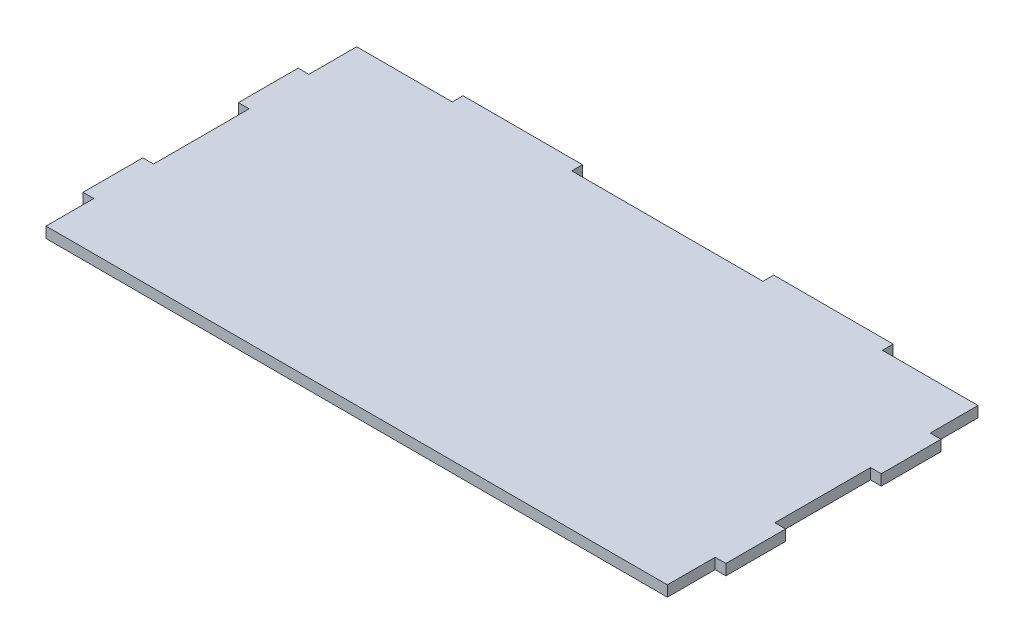
ISO-10303-21;
HEADER;
FILE_DESCRIPTION(('STEP AP214'),'2;1');
FILE_NAME('part.step','',(''),(''),'','','');
FILE_SCHEMA(('AUTOMOTIVE_DESIGN { 1 0 10303 214 1 1 1 1 }'));
ENDSEC;
DATA;
#1=APPLICATION_CONTEXT('core data for automotive mechanical design processes');
#2=APPLICATION_PROTOCOL_DEFINITION('international standard','automotive_design',2000,#1);
#3=PRODUCT_CONTEXT('',#1,'mechanical');
#4=PRODUCT('Part','Part','',(#3));
#5=PRODUCT_RELATED_PRODUCT_CATEGORY('part','',(#4));
#6=PRODUCT_DEFINITION_FORMATION('','',#4);
#7=PRODUCT_DEFINITION_CONTEXT('part definition',#1,'design');
#8=PRODUCT_DEFINITION('design','',#6,#7);
#9=PRODUCT_DEFINITION_SHAPE('','',#8);
#10=(LENGTH_UNIT() NAMED_UNIT(*) SI_UNIT(.MILLI.,.METRE.));
#11=(NAMED_UNIT(*) PLANE_ANGLE_UNIT() SI_UNIT($,.RADIAN.));
#12=(NAMED_UNIT(*) SI_UNIT($,.STERADIAN.) SOLID_ANGLE_UNIT());
#13=UNCERTAINTY_MEASURE_WITH_UNIT(LENGTH_MEASURE(1.E-05),#10,'distance_accuracy_value','');
#14=(GEOMETRIC_REPRESENTATION_CONTEXT(3) GLOBAL_UNCERTAINTY_ASSIGNED_CONTEXT((#13)) GLOBAL_UNIT_ASSIGNED_CONTEXT((#10,
#11,#12)) REPRESENTATION_CONTEXT('',''));
#15=CARTESIAN_POINT('',(0.,0.,0.));
#16=DIRECTION('',(0.,0.,1.));
#17=DIRECTION('',(1.,0.,0.));
#18=AXIS2_PLACEMENT_3D('',#15,#16,#17);
#19=CARTESIAN_POINT('',(-120.769894134906,4.5,-92.5932694831933));
#20=DIRECTION('',(1.,0.,0.));
#21=DIRECTION('',(0.,0.,-1.));
#22=AXIS2_PLACEMENT_3D('',#19,#20,#21);
#23=PLANE('',#22);
#24=DIRECTION('',(0.,0.,1.));
#25=VECTOR('',#24,1.);
#26=CARTESIAN_POINT('',(-120.769894134906,0.,-92.5932694831933));
#27=LINE('',#26,#25);
#28=CARTESIAN_POINT('',(-120.769894134906,0.,-92.5932694831933));
#29=VERTEX_POINT('',#28);
#30=CARTESIAN_POINT('',(-120.769894134906,0.,-72.5932694831932));
#31=VERTEX_POINT('',#30);
#32=EDGE_CURVE('E249',#29,#31,#27,.T.);
#33=ORIENTED_EDGE('',*,*,#32,.T.);
#34=DIRECTION('',(0.,-1.,0.));
#35=VECTOR('',#34,1.);
#36=CARTESIAN_POINT('',(-120.769894134906,4.5,-72.5932694831932));
#37=LINE('',#36,#35);
#38=CARTESIAN_POINT('',(-120.769894134906,4.5,-72.5932694831932));
#39=VERTEX_POINT('',#38);
#40=EDGE_CURVE('E11',#39,#31,#37,.T.);
#41=ORIENTED_EDGE('',*,*,#40,.F.);
#42=DIRECTION('',(0.,0.,1.));
#43=VECTOR('',#42,1.);
#44=CARTESIAN_POINT('',(-120.769894134906,4.5,-92.5932694831933));
#45=LINE('',#44,#43);
#46=CARTESIAN_POINT('',(-120.769894134906,4.5,-92.5932694831933));
#47=VERTEX_POINT('',#46);
#48=EDGE_CURVE('E303',#47,#39,#45,.T.);
#49=ORIENTED_EDGE('',*,*,#48,.F.);
#50=DIRECTION('',(0.,-1.,0.));
#51=VECTOR('',#50,1.);
#52=CARTESIAN_POINT('',(-120.769894134906,4.5,-92.5932694831933));
#53=LINE('',#52,#51);
#54=EDGE_CURVE('E245',#47,#29,#53,.T.);
#55=ORIENTED_EDGE('',*,*,#54,.T.);
#56=EDGE_LOOP('',(#33,#41,#49,#55));
#57=FACE_BOUND('',#56,.T.);
#58=ADVANCED_FACE('F33',(#57),#23,.F.);
#59=CARTESIAN_POINT('',(-120.769894134906,4.5,-72.5932694831932));
#60=DIRECTION('',(0.,0.,1.));
#61=DIRECTION('',(1.,0.,0.));
#62=AXIS2_PLACEMENT_3D('',#59,#60,#61);
#63=PLANE('',#62);
#64=DIRECTION('',(-1.,0.,0.));
#65=VECTOR('',#64,1.);
#66=CARTESIAN_POINT('',(-120.769894134906,0.,-72.5932694831932));
#67=LINE('',#66,#65);
#68=CARTESIAN_POINT('',(-125.269894134906,0.,-72.5932694831932));
#69=VERTEX_POINT('',#68);
#70=EDGE_CURVE('E252',#31,#69,#67,.T.);
#71=ORIENTED_EDGE('',*,*,#70,.T.);
#72=DIRECTION('',(0.,-1.,0.));
#73=VECTOR('',#72,1.);
#74=CARTESIAN_POINT('',(-125.269894134906,4.5,-72.5932694831932));
#75=LINE('',#74,#73);
#76=CARTESIAN_POINT('',(-125.269894134906,4.5,-72.5932694831932));
#77=VERTEX_POINT('',#76);
#78=EDGE_CURVE('E41',#77,#69,#75,.T.);
#79=ORIENTED_EDGE('',*,*,#78,.F.);
#80=DIRECTION('',(-1.,0.,0.));
#81=VECTOR('',#80,1.);
#82=CARTESIAN_POINT('',(-120.769894134906,4.5,-72.5932694831932));
#83=LINE('',#82,#81);
#84=EDGE_CURVE('E152',#39,#77,#83,.T.);
#85=ORIENTED_EDGE('',*,*,#84,.F.);
#86=ORIENTED_EDGE('',*,*,#40,.T.);
#87=EDGE_LOOP('',(#71,#79,#85,#86));
#88=FACE_BOUND('',#87,.T.);
#89=ADVANCED_FACE('F461',(#88),#63,.F.);
#90=CARTESIAN_POINT('',(-125.269894134906,4.5,-72.5932694831932));
#91=DIRECTION('',(1.,0.,0.));
#92=DIRECTION('',(0.,0.,-1.));
#93=AXIS2_PLACEMENT_3D('',#90,#91,#92);
#94=PLANE('',#93);
#95=DIRECTION('',(0.,0.,1.));
#96=VECTOR('',#95,1.);
#97=CARTESIAN_POINT('',(-125.269894134906,0.,-72.5932694831932));
#98=LINE('',#97,#96);
#99=CARTESIAN_POINT('',(-125.269894134906,0.,-47.5932694831932));
#100=VERTEX_POINT('',#99);
#101=EDGE_CURVE('E254',#69,#100,#98,.T.);
#102=ORIENTED_EDGE('',*,*,#101,.T.);
#103=DIRECTION('',(0.,-1.,0.));
#104=VECTOR('',#103,1.);
#105=CARTESIAN_POINT('',(-125.269894134906,4.5,-47.5932694831932));
#106=LINE('',#105,#104);
#107=CARTESIAN_POINT('',(-125.269894134906,4.5,-47.5932694831932));
#108=VERTEX_POINT('',#107);
#109=EDGE_CURVE('E370',#108,#100,#106,.T.);
#110=ORIENTED_EDGE('',*,*,#109,.F.);
#111=DIRECTION('',(0.,0.,1.));
#112=VECTOR('',#111,1.);
#113=CARTESIAN_POINT('',(-125.269894134906,4.5,-72.5932694831932));
#114=LINE('',#113,#112);
#115=EDGE_CURVE('E378',#77,#108,#114,.T.);
#116=ORIENTED_EDGE('',*,*,#115,.F.);
#117=ORIENTED_EDGE('',*,*,#78,.T.);
#118=EDGE_LOOP('',(#102,#110,#116,#117));
#119=FACE_BOUND('',#118,.T.);
#120=ADVANCED_FACE('F376',(#119),#94,.F.);
#121=CARTESIAN_POINT('',(-120.769894134906,4.5,-47.5932694831932));
#122=DIRECTION('',(0.,0.,-1.));
#123=DIRECTION('',(-1.,0.,0.));
#124=AXIS2_PLACEMENT_3D('',#121,#122,#123);
#125=PLANE('',#124);
#126=DIRECTION('',(1.,0.,0.));
#127=VECTOR('',#126,1.);
#128=CARTESIAN_POINT('',(-120.769894134906,0.,-47.5932694831932));
#129=LINE('',#128,#127);
#130=CARTESIAN_POINT('',(-120.769894134906,0.,-47.5932694831932));
#131=VERTEX_POINT('',#130);
#132=EDGE_CURVE('E256',#100,#131,#129,.T.);
#133=ORIENTED_EDGE('',*,*,#132,.T.);
#134=DIRECTION('',(0.,-1.,0.));
#135=VECTOR('',#134,1.);
#136=CARTESIAN_POINT('',(-120.769894134906,4.5,-47.5932694831932));
#137=LINE('',#136,#135);
#138=CARTESIAN_POINT('',(-120.769894134906,4.5,-47.5932694831932));
#139=VERTEX_POINT('',#138);
#140=EDGE_CURVE('E367',#139,#131,#137,.T.);
#141=ORIENTED_EDGE('',*,*,#140,.F.);
#142=DIRECTION('',(1.,0.,0.));
#143=VECTOR('',#142,1.);
#144=CARTESIAN_POINT('',(-120.769894134906,4.5,-47.5932694831932));
#145=LINE('',#144,#143);
#146=EDGE_CURVE('E396',#108,#139,#145,.T.);
#147=ORIENTED_EDGE('',*,*,#146,.F.);
#148=ORIENTED_EDGE('',*,*,#109,.T.);
#149=EDGE_LOOP('',(#133,#141,#147,#148));
#150=FACE_BOUND('',#149,.T.);
#151=ADVANCED_FACE('F387',(#150),#125,.F.);
#152=CARTESIAN_POINT('',(-120.769894134906,4.5,-47.5932694831932));
#153=DIRECTION('',(1.,0.,0.));
#154=DIRECTION('',(0.,0.,-1.));
#155=AXIS2_PLACEMENT_3D('',#152,#153,#154);
#156=PLANE('',#155);
#157=DIRECTION('',(0.,0.,1.));
#158=VECTOR('',#157,1.);
#159=CARTESIAN_POINT('',(-120.769894134906,0.,-47.5932694831932));
#160=LINE('',#159,#158);
#161=CARTESIAN_POINT('',(-120.769894134906,0.,-7.59326948319324));
#162=VERTEX_POINT('',#161);
#163=EDGE_CURVE('E258',#131,#162,#160,.T.);
#164=ORIENTED_EDGE('',*,*,#163,.T.);
#165=DIRECTION('',(0.,-1.,0.));
#166=VECTOR('',#165,1.);
#167=CARTESIAN_POINT('',(-120.769894134906,4.5,-7.59326948319324));
#168=LINE('',#167,#166);
#169=CARTESIAN_POINT('',(-120.769894134906,4.5,-7.59326948319324));
#170=VERTEX_POINT('',#169);
#171=EDGE_CURVE('E364',#170,#162,#168,.T.);
#172=ORIENTED_EDGE('',*,*,#171,.F.);
#173=DIRECTION('',(0.,0.,1.));
#174=VECTOR('',#173,1.);
#175=CARTESIAN_POINT('',(-120.769894134906,4.5,-47.5932694831932));
#176=LINE('',#175,#174);
#177=EDGE_CURVE('E393',#139,#170,#176,.T.);
#178=ORIENTED_EDGE('',*,*,#177,.F.);
#179=ORIENTED_EDGE('',*,*,#140,.T.);
#180=EDGE_LOOP('',(#164,#172,#178,#179));
#181=FACE_BOUND('',#180,.T.);
#182=ADVANCED_FACE('F391',(#181),#156,.F.);
#183=CARTESIAN_POINT('',(-120.769894134906,4.5,-7.59326948319324));
#184=DIRECTION('',(0.,0.,1.));
#185=DIRECTION('',(1.,0.,0.));
#186=AXIS2_PLACEMENT_3D('',#183,#184,#185);
#187=PLANE('',#186);
#188=DIRECTION('',(-1.,0.,0.));
#189=VECTOR('',#188,1.);
#190=CARTESIAN_POINT('',(-120.769894134906,0.,-7.59326948319324));
#191=LINE('',#190,#189);
#192=CARTESIAN_POINT('',(-125.269894134906,0.,-7.59326948319324));
#193=VERTEX_POINT('',#192);
#194=EDGE_CURVE('E260',#162,#193,#191,.T.);
#195=ORIENTED_EDGE('',*,*,#194,.T.);
#196=DIRECTION('',(0.,-1.,0.));
#197=VECTOR('',#196,1.);
#198=CARTESIAN_POINT('',(-125.269894134906,4.5,-7.59326948319324));
#199=LINE('',#198,#197);
#200=CARTESIAN_POINT('',(-125.269894134906,4.5,-7.59326948319324));
#201=VERTEX_POINT('',#200);
#202=EDGE_CURVE('E361',#201,#193,#199,.T.);
#203=ORIENTED_EDGE('',*,*,#202,.F.);
#204=DIRECTION('',(-1.,0.,0.));
#205=VECTOR('',#204,1.);
#206=CARTESIAN_POINT('',(-120.769894134906,4.5,-7.59326948319324));
#207=LINE('',#206,#205);
#208=EDGE_CURVE('E395',#170,#201,#207,.T.);
#209=ORIENTED_EDGE('',*,*,#208,.F.);
#210=ORIENTED_EDGE('',*,*,#171,.T.);
#211=EDGE_LOOP('',(#195,#203,#209,#210));
#212=FACE_BOUND('',#211,.T.);
#213=ADVANCED_FACE('F474',(#212),#187,.F.);
#214=CARTESIAN_POINT('',(-125.269894134906,4.5,17.4067305168068));
#215=DIRECTION('',(1.,0.,0.));
#216=DIRECTION('',(0.,0.,-1.));
#217=AXIS2_PLACEMENT_3D('',#214,#215,#216);
#218=PLANE('',#217);
#219=DIRECTION('',(0.,0.,1.));
#220=VECTOR('',#219,1.);
#221=CARTESIAN_POINT('',(-125.269894134906,0.,17.4067305168068));
#222=LINE('',#221,#220);
#223=CARTESIAN_POINT('',(-125.269894134906,0.,17.4067305168068));
#224=VERTEX_POINT('',#223);
#225=EDGE_CURVE('E262',#193,#224,#222,.T.);
#226=ORIENTED_EDGE('',*,*,#225,.T.);
#227=DIRECTION('',(0.,-1.,0.));
#228=VECTOR('',#227,1.);
#229=CARTESIAN_POINT('',(-125.269894134906,4.5,17.4067305168068));
#230=LINE('',#229,#228);
#231=CARTESIAN_POINT('',(-125.269894134906,4.5,17.4067305168068));
#232=VERTEX_POINT('',#231);
#233=EDGE_CURVE('E358',#232,#224,#230,.T.);
#234=ORIENTED_EDGE('',*,*,#233,.F.);
#235=DIRECTION('',(0.,0.,1.));
#236=VECTOR('',#235,1.);
#237=CARTESIAN_POINT('',(-125.269894134906,4.5,17.4067305168068));
#238=LINE('',#237,#236);
#239=EDGE_CURVE('E398',#201,#232,#238,.T.);
#240=ORIENTED_EDGE('',*,*,#239,.F.);
#241=ORIENTED_EDGE('',*,*,#202,.T.);
#242=EDGE_LOOP('',(#226,#234,#240,#241));
#243=FACE_BOUND('',#242,.T.);
#244=ADVANCED_FACE('F477',(#243),#218,.F.);
#245=CARTESIAN_POINT('',(-120.769894134906,4.5,17.4067305168068));
#246=DIRECTION('',(0.,0.,-1.));
#247=DIRECTION('',(-1.,0.,0.));
#248=AXIS2_PLACEMENT_3D('',#245,#246,#247);
#249=PLANE('',#248);
#250=DIRECTION('',(1.,0.,0.));
#251=VECTOR('',#250,1.);
#252=CARTESIAN_POINT('',(-120.769894134906,0.,17.4067305168068));
#253=LINE('',#252,#251);
#254=CARTESIAN_POINT('',(-120.769894134906,0.,17.4067305168068));
#255=VERTEX_POINT('',#254);
#256=EDGE_CURVE('E264',#224,#255,#253,.T.);
#257=ORIENTED_EDGE('',*,*,#256,.T.);
#258=DIRECTION('',(0.,-1.,0.));
#259=VECTOR('',#258,1.);
#260=CARTESIAN_POINT('',(-120.769894134906,4.5,17.4067305168068));
#261=LINE('',#260,#259);
#262=CARTESIAN_POINT('',(-120.769894134906,4.5,17.4067305168068));
#263=VERTEX_POINT('',#262);
#264=EDGE_CURVE('E355',#263,#255,#261,.T.);
#265=ORIENTED_EDGE('',*,*,#264,.F.);
#266=DIRECTION('',(1.,0.,0.));
#267=VECTOR('',#266,1.);
#268=CARTESIAN_POINT('',(-120.769894134906,4.5,17.4067305168068));
#269=LINE('',#268,#267);
#270=EDGE_CURVE('E404',#232,#263,#269,.T.);
#271=ORIENTED_EDGE('',*,*,#270,.F.);
#272=ORIENTED_EDGE('',*,*,#233,.T.);
#273=EDGE_LOOP('',(#257,#265,#271,#272));
#274=FACE_BOUND('',#273,.T.);
#275=ADVANCED_FACE('F481',(#274),#249,.F.);
#276=CARTESIAN_POINT('',(-120.769894134906,4.5,17.4067305168068));
#277=DIRECTION('',(1.,0.,0.));
#278=DIRECTION('',(0.,0.,-1.));
#279=AXIS2_PLACEMENT_3D('',#276,#277,#278);
#280=PLANE('',#279);
#281=DIRECTION('',(0.,0.,1.));
#282=VECTOR('',#281,1.);
#283=CARTESIAN_POINT('',(-120.769894134906,0.,17.4067305168068));
#284=LINE('',#283,#282);
#285=CARTESIAN_POINT('',(-120.769894134906,0.,37.4067305168068));
#286=VERTEX_POINT('',#285);
#287=EDGE_CURVE('E266',#255,#286,#284,.T.);
#288=ORIENTED_EDGE('',*,*,#287,.T.);
#289=DIRECTION('',(0.,-1.,0.));
#290=VECTOR('',#289,1.);
#291=CARTESIAN_POINT('',(-120.769894134906,4.5,37.4067305168068));
#292=LINE('',#291,#290);
#293=CARTESIAN_POINT('',(-120.769894134906,4.5,37.4067305168068));
#294=VERTEX_POINT('',#293);
#295=EDGE_CURVE('E352',#294,#286,#292,.T.);
#296=ORIENTED_EDGE('',*,*,#295,.F.);
#297=DIRECTION('',(0.,0.,1.));
#298=VECTOR('',#297,1.);
#299=CARTESIAN_POINT('',(-120.769894134906,4.5,17.4067305168068));
#300=LINE('',#299,#298);
#301=EDGE_CURVE('E406',#263,#294,#300,.T.);
#302=ORIENTED_EDGE('',*,*,#301,.F.);
#303=ORIENTED_EDGE('',*,*,#264,.T.);
#304=EDGE_LOOP('',(#288,#296,#302,#303));
#305=FACE_BOUND('',#304,.T.);
#306=ADVANCED_FACE('F485',(#305),#280,.F.);
#307=CARTESIAN_POINT('',(-120.769894134906,4.5,37.4067305168068));
#308=DIRECTION('',(0.,0.,-1.));
#309=DIRECTION('',(-1.,0.,0.));
#310=AXIS2_PLACEMENT_3D('',#307,#308,#309);
#311=PLANE('',#310);
#312=DIRECTION('',(1.,0.,0.));
#313=VECTOR('',#312,1.);
#314=CARTESIAN_POINT('',(-120.769894134906,0.,37.4067305168068));
#315=LINE('',#314,#313);
#316=CARTESIAN_POINT('',(139.230105865094,0.,37.4067305168068));
#317=VERTEX_POINT('',#316);
#318=EDGE_CURVE('E268',#286,#317,#315,.T.);
#319=ORIENTED_EDGE('',*,*,#318,.T.);
#320=DIRECTION('',(0.,-1.,0.));
#321=VECTOR('',#320,1.);
#322=CARTESIAN_POINT('',(139.230105865094,4.5,37.4067305168068));
#323=LINE('',#322,#321);
#324=CARTESIAN_POINT('',(139.230105865094,4.5,37.4067305168068));
#325=VERTEX_POINT('',#324);
#326=EDGE_CURVE('E349',#325,#317,#323,.T.);
#327=ORIENTED_EDGE('',*,*,#326,.F.);
#328=DIRECTION('',(1.,0.,0.));
#329=VECTOR('',#328,1.);
#330=CARTESIAN_POINT('',(-120.769894134906,4.5,37.4067305168068));
#331=LINE('',#330,#329);
#332=EDGE_CURVE('E408',#294,#325,#331,.T.);
#333=ORIENTED_EDGE('',*,*,#332,.F.);
#334=ORIENTED_EDGE('',*,*,#295,.T.);
#335=EDGE_LOOP('',(#319,#327,#333,#334));
#336=FACE_BOUND('',#335,.T.);
#337=ADVANCED_FACE('F489',(#336),#311,.F.);
#338=CARTESIAN_POINT('',(139.230105865094,4.5,17.4067305168068));
#339=DIRECTION('',(-1.,0.,0.));
#340=DIRECTION('',(0.,0.,1.));
#341=AXIS2_PLACEMENT_3D('',#338,#339,#340);
#342=PLANE('',#341);
#343=DIRECTION('',(0.,0.,-1.));
#344=VECTOR('',#343,1.);
#345=CARTESIAN_POINT('',(139.230105865094,0.,17.4067305168068));
#346=LINE('',#345,#344);
#347=CARTESIAN_POINT('',(139.230105865094,0.,17.4067305168068));
#348=VERTEX_POINT('',#347);
#349=EDGE_CURVE('E270',#317,#348,#346,.T.);
#350=ORIENTED_EDGE('',*,*,#349,.T.);
#351=DIRECTION('',(0.,-1.,0.));
#352=VECTOR('',#351,1.);
#353=CARTESIAN_POINT('',(139.230105865094,4.5,17.4067305168068));
#354=LINE('',#353,#352);
#355=CARTESIAN_POINT('',(139.230105865094,4.5,17.4067305168068));
#356=VERTEX_POINT('',#355);
#357=EDGE_CURVE('E346',#356,#348,#354,.T.);
#358=ORIENTED_EDGE('',*,*,#357,.F.);
#359=DIRECTION('',(0.,0.,-1.));
#360=VECTOR('',#359,1.);
#361=CARTESIAN_POINT('',(139.230105865094,4.5,17.4067305168068));
#362=LINE('',#361,#360);
#363=EDGE_CURVE('E410',#325,#356,#362,.T.);
#364=ORIENTED_EDGE('',*,*,#363,.F.);
#365=ORIENTED_EDGE('',*,*,#326,.T.);
#366=EDGE_LOOP('',(#350,#358,#364,#365));
#367=FACE_BOUND('',#366,.T.);
#368=ADVANCED_FACE('F493',(#367),#342,.F.);
#369=CARTESIAN_POINT('',(139.230105865094,4.5,17.4067305168068));
#370=DIRECTION('',(0.,0.,-1.));
#371=DIRECTION('',(-1.,0.,0.));
#372=AXIS2_PLACEMENT_3D('',#369,#370,#371);
#373=PLANE('',#372);
#374=DIRECTION('',(1.,0.,0.));
#375=VECTOR('',#374,1.);
#376=CARTESIAN_POINT('',(139.230105865094,0.,17.4067305168068));
#377=LINE('',#376,#375);
#378=CARTESIAN_POINT('',(143.730105865094,0.,17.4067305168068));
#379=VERTEX_POINT('',#378);
#380=EDGE_CURVE('E272',#348,#379,#377,.T.);
#381=ORIENTED_EDGE('',*,*,#380,.T.);
#382=DIRECTION('',(0.,-1.,0.));
#383=VECTOR('',#382,1.);
#384=CARTESIAN_POINT('',(143.730105865094,4.5,17.4067305168068));
#385=LINE('',#384,#383);
#386=CARTESIAN_POINT('',(143.730105865094,4.5,17.4067305168068));
#387=VERTEX_POINT('',#386);
#388=EDGE_CURVE('E343',#387,#379,#385,.T.);
#389=ORIENTED_EDGE('',*,*,#388,.F.);
#390=DIRECTION('',(1.,0.,0.));
#391=VECTOR('',#390,1.);
#392=CARTESIAN_POINT('',(139.230105865094,4.5,17.4067305168068));
#393=LINE('',#392,#391);
#394=EDGE_CURVE('E412',#356,#387,#393,.T.);
#395=ORIENTED_EDGE('',*,*,#394,.F.);
#396=ORIENTED_EDGE('',*,*,#357,.T.);
#397=EDGE_LOOP('',(#381,#389,#395,#396));
#398=FACE_BOUND('',#397,.T.);
#399=ADVANCED_FACE('F497',(#398),#373,.F.);
#400=CARTESIAN_POINT('',(143.730105865094,4.5,17.4067305168068));
#401=DIRECTION('',(-1.,0.,0.));
#402=DIRECTION('',(0.,0.,1.));
#403=AXIS2_PLACEMENT_3D('',#400,#401,#402);
#404=PLANE('',#403);
#405=DIRECTION('',(0.,0.,-1.));
#406=VECTOR('',#405,1.);
#407=CARTESIAN_POINT('',(143.730105865094,0.,17.4067305168068));
#408=LINE('',#407,#406);
#409=CARTESIAN_POINT('',(143.730105865094,0.,-7.59326948319324));
#410=VERTEX_POINT('',#409);
#411=EDGE_CURVE('E274',#379,#410,#408,.T.);
#412=ORIENTED_EDGE('',*,*,#411,.T.);
#413=DIRECTION('',(0.,-1.,0.));
#414=VECTOR('',#413,1.);
#415=CARTESIAN_POINT('',(143.730105865094,4.5,-7.59326948319324));
#416=LINE('',#415,#414);
#417=CARTESIAN_POINT('',(143.730105865094,4.5,-7.59326948319324));
#418=VERTEX_POINT('',#417);
#419=EDGE_CURVE('E340',#418,#410,#416,.T.);
#420=ORIENTED_EDGE('',*,*,#419,.F.);
#421=DIRECTION('',(0.,0.,-1.));
#422=VECTOR('',#421,1.);
#423=CARTESIAN_POINT('',(143.730105865094,4.5,17.4067305168068));
#424=LINE('',#423,#422);
#425=EDGE_CURVE('E414',#387,#418,#424,.T.);
#426=ORIENTED_EDGE('',*,*,#425,.F.);
#427=ORIENTED_EDGE('',*,*,#388,.T.);
#428=EDGE_LOOP('',(#412,#420,#426,#427));
#429=FACE_BOUND('',#428,.T.);
#430=ADVANCED_FACE('F501',(#429),#404,.F.);
#431=CARTESIAN_POINT('',(139.230105865094,4.5,-7.59326948319324));
#432=DIRECTION('',(0.,0.,1.));
#433=DIRECTION('',(1.,0.,0.));
#434=AXIS2_PLACEMENT_3D('',#431,#432,#433);
#435=PLANE('',#434);
#436=DIRECTION('',(-1.,0.,0.));
#437=VECTOR('',#436,1.);
#438=CARTESIAN_POINT('',(139.230105865094,0.,-7.59326948319324));
#439=LINE('',#438,#437);
#440=CARTESIAN_POINT('',(139.230105865094,0.,-7.59326948319324));
#441=VERTEX_POINT('',#440);
#442=EDGE_CURVE('E276',#410,#441,#439,.T.);
#443=ORIENTED_EDGE('',*,*,#442,.T.);
#444=DIRECTION('',(0.,-1.,0.));
#445=VECTOR('',#444,1.);
#446=CARTESIAN_POINT('',(139.230105865094,4.5,-7.59326948319324));
#447=LINE('',#446,#445);
#448=CARTESIAN_POINT('',(139.230105865094,4.5,-7.59326948319324));
#449=VERTEX_POINT('',#448);
#450=EDGE_CURVE('E337',#449,#441,#447,.T.);
#451=ORIENTED_EDGE('',*,*,#450,.F.);
#452=DIRECTION('',(-1.,0.,0.));
#453=VECTOR('',#452,1.);
#454=CARTESIAN_POINT('',(139.230105865094,4.5,-7.59326948319324));
#455=LINE('',#454,#453);
#456=EDGE_CURVE('E416',#418,#449,#455,.T.);
#457=ORIENTED_EDGE('',*,*,#456,.F.);
#458=ORIENTED_EDGE('',*,*,#419,.T.);
#459=EDGE_LOOP('',(#443,#451,#457,#458));
#460=FACE_BOUND('',#459,.T.);
#461=ADVANCED_FACE('F505',(#460),#435,.F.);
#462=CARTESIAN_POINT('',(139.230105865094,4.5,-47.5932694831932));
#463=DIRECTION('',(-1.,0.,0.));
#464=DIRECTION('',(0.,0.,1.));
#465=AXIS2_PLACEMENT_3D('',#462,#463,#464);
#466=PLANE('',#465);
#467=DIRECTION('',(0.,0.,-1.));
#468=VECTOR('',#467,1.);
#469=CARTESIAN_POINT('',(139.230105865094,0.,-47.5932694831932));
#470=LINE('',#469,#468);
#471=CARTESIAN_POINT('',(139.230105865094,0.,-47.5932694831932));
#472=VERTEX_POINT('',#471);
#473=EDGE_CURVE('E278',#441,#472,#470,.T.);
#474=ORIENTED_EDGE('',*,*,#473,.T.);
#475=DIRECTION('',(0.,-1.,0.));
#476=VECTOR('',#475,1.);
#477=CARTESIAN_POINT('',(139.230105865094,4.5,-47.5932694831932));
#478=LINE('',#477,#476);
#479=CARTESIAN_POINT('',(139.230105865094,4.5,-47.5932694831932));
#480=VERTEX_POINT('',#479);
#481=EDGE_CURVE('E334',#480,#472,#478,.T.);
#482=ORIENTED_EDGE('',*,*,#481,.F.);
#483=DIRECTION('',(0.,0.,-1.));
#484=VECTOR('',#483,1.);
#485=CARTESIAN_POINT('',(139.230105865094,4.5,-47.5932694831932));
#486=LINE('',#485,#484);
#487=EDGE_CURVE('E418',#449,#480,#486,.T.);
#488=ORIENTED_EDGE('',*,*,#487,.F.);
#489=ORIENTED_EDGE('',*,*,#450,.T.);
#490=EDGE_LOOP('',(#474,#482,#488,#489));
#491=FACE_BOUND('',#490,.T.);
#492=ADVANCED_FACE('F509',(#491),#466,.F.);
#493=CARTESIAN_POINT('',(139.230105865094,4.5,-47.5932694831932));
#494=DIRECTION('',(0.,0.,-1.));
#495=DIRECTION('',(-1.,0.,0.));
#496=AXIS2_PLACEMENT_3D('',#493,#494,#495);
#497=PLANE('',#496);
#498=DIRECTION('',(1.,0.,0.));
#499=VECTOR('',#498,1.);
#500=CARTESIAN_POINT('',(139.230105865094,0.,-47.5932694831932));
#501=LINE('',#500,#499);
#502=CARTESIAN_POINT('',(143.730105865094,0.,-47.5932694831932));
#503=VERTEX_POINT('',#502);
#504=EDGE_CURVE('E280',#472,#503,#501,.T.);
#505=ORIENTED_EDGE('',*,*,#504,.T.);
#506=DIRECTION('',(0.,-1.,0.));
#507=VECTOR('',#506,1.);
#508=CARTESIAN_POINT('',(143.730105865094,4.5,-47.5932694831932));
#509=LINE('',#508,#507);
#510=CARTESIAN_POINT('',(143.730105865094,4.5,-47.5932694831932));
#511=VERTEX_POINT('',#510);
#512=EDGE_CURVE('E331',#511,#503,#509,.T.);
#513=ORIENTED_EDGE('',*,*,#512,.F.);
#514=DIRECTION('',(1.,0.,0.));
#515=VECTOR('',#514,1.);
#516=CARTESIAN_POINT('',(139.230105865094,4.5,-47.5932694831932));
#517=LINE('',#516,#515);
#518=EDGE_CURVE('E420',#480,#511,#517,.T.);
#519=ORIENTED_EDGE('',*,*,#518,.F.);
#520=ORIENTED_EDGE('',*,*,#481,.T.);
#521=EDGE_LOOP('',(#505,#513,#519,#520));
#522=FACE_BOUND('',#521,.T.);
#523=ADVANCED_FACE('F513',(#522),#497,.F.);
#524=CARTESIAN_POINT('',(143.730105865094,4.5,-72.5932694831933));
#525=DIRECTION('',(-1.,0.,0.));
#526=DIRECTION('',(0.,0.,1.));
#527=AXIS2_PLACEMENT_3D('',#524,#525,#526);
#528=PLANE('',#527);
#529=DIRECTION('',(0.,0.,-1.));
#530=VECTOR('',#529,1.);
#531=CARTESIAN_POINT('',(143.730105865094,0.,-72.5932694831933));
#532=LINE('',#531,#530);
#533=CARTESIAN_POINT('',(143.730105865094,0.,-72.5932694831933));
#534=VERTEX_POINT('',#533);
#535=EDGE_CURVE('E282',#503,#534,#532,.T.);
#536=ORIENTED_EDGE('',*,*,#535,.T.);
#537=DIRECTION('',(0.,-1.,0.));
#538=VECTOR('',#537,1.);
#539=CARTESIAN_POINT('',(143.730105865094,4.5,-72.5932694831933));
#540=LINE('',#539,#538);
#541=CARTESIAN_POINT('',(143.730105865094,4.5,-72.5932694831933));
#542=VERTEX_POINT('',#541);
#543=EDGE_CURVE('E328',#542,#534,#540,.T.);
#544=ORIENTED_EDGE('',*,*,#543,.F.);
#545=DIRECTION('',(0.,0.,-1.));
#546=VECTOR('',#545,1.);
#547=CARTESIAN_POINT('',(143.730105865094,4.5,-72.5932694831933));
#548=LINE('',#547,#546);
#549=EDGE_CURVE('E422',#511,#542,#548,.T.);
#550=ORIENTED_EDGE('',*,*,#549,.F.);
#551=ORIENTED_EDGE('',*,*,#512,.T.);
#552=EDGE_LOOP('',(#536,#544,#550,#551));
#553=FACE_BOUND('',#552,.T.);
#554=ADVANCED_FACE('F517',(#553),#528,.F.);
#555=CARTESIAN_POINT('',(139.230105865094,4.5,-72.5932694831933));
#556=DIRECTION('',(0.,0.,1.));
#557=DIRECTION('',(1.,0.,0.));
#558=AXIS2_PLACEMENT_3D('',#555,#556,#557);
#559=PLANE('',#558);
#560=DIRECTION('',(-1.,0.,0.));
#561=VECTOR('',#560,1.);
#562=CARTESIAN_POINT('',(139.230105865094,0.,-72.5932694831933));
#563=LINE('',#562,#561);
#564=CARTESIAN_POINT('',(139.230105865094,0.,-72.5932694831933));
#565=VERTEX_POINT('',#564);
#566=EDGE_CURVE('E284',#534,#565,#563,.T.);
#567=ORIENTED_EDGE('',*,*,#566,.T.);
#568=DIRECTION('',(0.,-1.,0.));
#569=VECTOR('',#568,1.);
#570=CARTESIAN_POINT('',(139.230105865094,4.5,-72.5932694831933));
#571=LINE('',#570,#569);
#572=CARTESIAN_POINT('',(139.230105865094,4.5,-72.5932694831933));
#573=VERTEX_POINT('',#572);
#574=EDGE_CURVE('E325',#573,#565,#571,.T.);
#575=ORIENTED_EDGE('',*,*,#574,.F.);
#576=DIRECTION('',(-1.,0.,0.));
#577=VECTOR('',#576,1.);
#578=CARTESIAN_POINT('',(139.230105865094,4.5,-72.5932694831933));
#579=LINE('',#578,#577);
#580=EDGE_CURVE('E424',#542,#573,#579,.T.);
#581=ORIENTED_EDGE('',*,*,#580,.F.);
#582=ORIENTED_EDGE('',*,*,#543,.T.);
#583=EDGE_LOOP('',(#567,#575,#581,#582));
#584=FACE_BOUND('',#583,.T.);
#585=ADVANCED_FACE('F521',(#584),#559,.F.);
#586=CARTESIAN_POINT('',(139.230105865094,4.5,-92.5932694831932));
#587=DIRECTION('',(-1.,0.,0.));
#588=DIRECTION('',(0.,0.,1.));
#589=AXIS2_PLACEMENT_3D('',#586,#587,#588);
#590=PLANE('',#589);
#591=DIRECTION('',(0.,0.,-1.));
#592=VECTOR('',#591,1.);
#593=CARTESIAN_POINT('',(139.230105865094,0.,-92.5932694831932));
#594=LINE('',#593,#592);
#595=CARTESIAN_POINT('',(139.230105865094,0.,-92.5932694831932));
#596=VERTEX_POINT('',#595);
#597=EDGE_CURVE('E286',#565,#596,#594,.T.);
#598=ORIENTED_EDGE('',*,*,#597,.T.);
#599=DIRECTION('',(0.,-1.,0.));
#600=VECTOR('',#599,1.);
#601=CARTESIAN_POINT('',(139.230105865094,4.5,-92.5932694831932));
#602=LINE('',#601,#600);
#603=CARTESIAN_POINT('',(139.230105865094,4.5,-92.5932694831932));
#604=VERTEX_POINT('',#603);
#605=EDGE_CURVE('E322',#604,#596,#602,.T.);
#606=ORIENTED_EDGE('',*,*,#605,.F.);
#607=DIRECTION('',(0.,0.,-1.));
#608=VECTOR('',#607,1.);
#609=CARTESIAN_POINT('',(139.230105865094,4.5,-92.5932694831932));
#610=LINE('',#609,#608);
#611=EDGE_CURVE('E426',#573,#604,#610,.T.);
#612=ORIENTED_EDGE('',*,*,#611,.F.);
#613=ORIENTED_EDGE('',*,*,#574,.T.);
#614=EDGE_LOOP('',(#598,#606,#612,#613));
#615=FACE_BOUND('',#614,.T.);
#616=ADVANCED_FACE('F525',(#615),#590,.F.);
#617=CARTESIAN_POINT('',(99.2301058650937,4.5,-92.5932694831932));
#618=DIRECTION('',(0.,0.,1.));
#619=DIRECTION('',(1.,0.,0.));
#620=AXIS2_PLACEMENT_3D('',#617,#618,#619);
#621=PLANE('',#620);
#622=DIRECTION('',(-1.,0.,0.));
#623=VECTOR('',#622,1.);
#624=CARTESIAN_POINT('',(99.2301058650937,0.,-92.5932694831932));
#625=LINE('',#624,#623);
#626=CARTESIAN_POINT('',(99.2301058650937,0.,-92.5932694831932));
#627=VERTEX_POINT('',#626);
#628=EDGE_CURVE('E288',#596,#627,#625,.T.);
#629=ORIENTED_EDGE('',*,*,#628,.T.);
#630=DIRECTION('',(0.,-1.,0.));
#631=VECTOR('',#630,1.);
#632=CARTESIAN_POINT('',(99.2301058650937,4.5,-92.5932694831932));
#633=LINE('',#632,#631);
#634=CARTESIAN_POINT('',(99.2301058650937,4.5,-92.5932694831932));
#635=VERTEX_POINT('',#634);
#636=EDGE_CURVE('E319',#635,#627,#633,.T.);
#637=ORIENTED_EDGE('',*,*,#636,.F.);
#638=DIRECTION('',(-1.,0.,0.));
#639=VECTOR('',#638,1.);
#640=CARTESIAN_POINT('',(99.2301058650937,4.5,-92.5932694831932));
#641=LINE('',#640,#639);
#642=EDGE_CURVE('E428',#604,#635,#641,.T.);
#643=ORIENTED_EDGE('',*,*,#642,.F.);
#644=ORIENTED_EDGE('',*,*,#605,.T.);
#645=EDGE_LOOP('',(#629,#637,#643,#644));
#646=FACE_BOUND('',#645,.T.);
#647=ADVANCED_FACE('F529',(#646),#621,.F.);
#648=CARTESIAN_POINT('',(99.2301058650937,4.5,-92.5932694831932));
#649=DIRECTION('',(-1.,0.,0.));
#650=DIRECTION('',(0.,0.,1.));
#651=AXIS2_PLACEMENT_3D('',#648,#649,#650);
#652=PLANE('',#651);
#653=DIRECTION('',(0.,0.,-1.));
#654=VECTOR('',#653,1.);
#655=CARTESIAN_POINT('',(99.2301058650937,0.,-92.5932694831932));
#656=LINE('',#655,#654);
#657=CARTESIAN_POINT('',(99.2301058650937,0.,-97.0932694831932));
#658=VERTEX_POINT('',#657);
#659=EDGE_CURVE('E290',#627,#658,#656,.T.);
#660=ORIENTED_EDGE('',*,*,#659,.T.);
#661=DIRECTION('',(0.,-1.,0.));
#662=VECTOR('',#661,1.);
#663=CARTESIAN_POINT('',(99.2301058650937,4.5,-97.0932694831932));
#664=LINE('',#663,#662);
#665=CARTESIAN_POINT('',(99.2301058650937,4.5,-97.0932694831932));
#666=VERTEX_POINT('',#665);
#667=EDGE_CURVE('E316',#666,#658,#664,.T.);
#668=ORIENTED_EDGE('',*,*,#667,.F.);
#669=DIRECTION('',(0.,0.,-1.));
#670=VECTOR('',#669,1.);
#671=CARTESIAN_POINT('',(99.2301058650937,4.5,-92.5932694831932));
#672=LINE('',#671,#670);
#673=EDGE_CURVE('E430',#635,#666,#672,.T.);
#674=ORIENTED_EDGE('',*,*,#673,.F.);
#675=ORIENTED_EDGE('',*,*,#636,.T.);
#676=EDGE_LOOP('',(#660,#668,#674,#675));
#677=FACE_BOUND('',#676,.T.);
#678=ADVANCED_FACE('F533',(#677),#652,.F.);
#679=CARTESIAN_POINT('',(99.2301058650937,4.5,-97.0932694831932));
#680=DIRECTION('',(0.,0.,1.));
#681=DIRECTION('',(1.,0.,0.));
#682=AXIS2_PLACEMENT_3D('',#679,#680,#681);
#683=PLANE('',#682);
#684=DIRECTION('',(-1.,0.,0.));
#685=VECTOR('',#684,1.);
#686=CARTESIAN_POINT('',(99.2301058650937,0.,-97.0932694831932));
#687=LINE('',#686,#685);
#688=CARTESIAN_POINT('',(49.2301058650937,0.,-97.0932694831932));
#689=VERTEX_POINT('',#688);
#690=EDGE_CURVE('E292',#658,#689,#687,.T.);
#691=ORIENTED_EDGE('',*,*,#690,.T.);
#692=DIRECTION('',(0.,-1.,0.));
#693=VECTOR('',#692,1.);
#694=CARTESIAN_POINT('',(49.2301058650937,4.5,-97.0932694831932));
#695=LINE('',#694,#693);
#696=CARTESIAN_POINT('',(49.2301058650937,4.5,-97.0932694831932));
#697=VERTEX_POINT('',#696);
#698=EDGE_CURVE('E313',#697,#689,#695,.T.);
#699=ORIENTED_EDGE('',*,*,#698,.F.);
#700=DIRECTION('',(-1.,0.,0.));
#701=VECTOR('',#700,1.);
#702=CARTESIAN_POINT('',(99.2301058650937,4.5,-97.0932694831932));
#703=LINE('',#702,#701);
#704=EDGE_CURVE('E432',#666,#697,#703,.T.);
#705=ORIENTED_EDGE('',*,*,#704,.F.);
#706=ORIENTED_EDGE('',*,*,#667,.T.);
#707=EDGE_LOOP('',(#691,#699,#705,#706));
#708=FACE_BOUND('',#707,.T.);
#709=ADVANCED_FACE('F537',(#708),#683,.F.);
#710=CARTESIAN_POINT('',(49.2301058650937,4.5,-92.5932694831932));
#711=DIRECTION('',(1.,0.,0.));
#712=DIRECTION('',(0.,0.,-1.));
#713=AXIS2_PLACEMENT_3D('',#710,#711,#712);
#714=PLANE('',#713);
#715=DIRECTION('',(0.,0.,1.));
#716=VECTOR('',#715,1.);
#717=CARTESIAN_POINT('',(49.2301058650937,0.,-92.5932694831932));
#718=LINE('',#717,#716);
#719=CARTESIAN_POINT('',(49.2301058650937,0.,-92.5932694831932));
#720=VERTEX_POINT('',#719);
#721=EDGE_CURVE('E294',#689,#720,#718,.T.);
#722=ORIENTED_EDGE('',*,*,#721,.T.);
#723=DIRECTION('',(0.,-1.,0.));
#724=VECTOR('',#723,1.);
#725=CARTESIAN_POINT('',(49.2301058650937,4.5,-92.5932694831932));
#726=LINE('',#725,#724);
#727=CARTESIAN_POINT('',(49.2301058650937,4.5,-92.5932694831932));
#728=VERTEX_POINT('',#727);
#729=EDGE_CURVE('E310',#728,#720,#726,.T.);
#730=ORIENTED_EDGE('',*,*,#729,.F.);
#731=DIRECTION('',(0.,0.,1.));
#732=VECTOR('',#731,1.);
#733=CARTESIAN_POINT('',(49.2301058650937,4.5,-92.5932694831932));
#734=LINE('',#733,#732);
#735=EDGE_CURVE('E434',#697,#728,#734,.T.);
#736=ORIENTED_EDGE('',*,*,#735,.F.);
#737=ORIENTED_EDGE('',*,*,#698,.T.);
#738=EDGE_LOOP('',(#722,#730,#736,#737));
#739=FACE_BOUND('',#738,.T.);
#740=ADVANCED_FACE('F541',(#739),#714,.F.);
#741=CARTESIAN_POINT('',(-30.7698941349063,4.5,-92.5932694831932));
#742=DIRECTION('',(0.,0.,1.));
#743=DIRECTION('',(1.,0.,0.));
#744=AXIS2_PLACEMENT_3D('',#741,#742,#743);
#745=PLANE('',#744);
#746=DIRECTION('',(-1.,0.,0.));
#747=VECTOR('',#746,1.);
#748=CARTESIAN_POINT('',(-30.7698941349063,0.,-92.5932694831932));
#749=LINE('',#748,#747);
#750=CARTESIAN_POINT('',(-30.7698941349063,0.,-92.5932694831932));
#751=VERTEX_POINT('',#750);
#752=EDGE_CURVE('E296',#720,#751,#749,.T.);
#753=ORIENTED_EDGE('',*,*,#752,.T.);
#754=DIRECTION('',(0.,-1.,0.));
#755=VECTOR('',#754,1.);
#756=CARTESIAN_POINT('',(-30.7698941349063,4.5,-92.5932694831932));
#757=LINE('',#756,#755);
#758=CARTESIAN_POINT('',(-30.7698941349063,4.5,-92.5932694831932));
#759=VERTEX_POINT('',#758);
#760=EDGE_CURVE('E307',#759,#751,#757,.T.);
#761=ORIENTED_EDGE('',*,*,#760,.F.);
#762=DIRECTION('',(-1.,0.,0.));
#763=VECTOR('',#762,1.);
#764=CARTESIAN_POINT('',(-30.7698941349063,4.5,-92.5932694831932));
#765=LINE('',#764,#763);
#766=EDGE_CURVE('E436',#728,#759,#765,.T.);
#767=ORIENTED_EDGE('',*,*,#766,.F.);
#768=ORIENTED_EDGE('',*,*,#729,.T.);
#769=EDGE_LOOP('',(#753,#761,#767,#768));
#770=FACE_BOUND('',#769,.T.);
#771=ADVANCED_FACE('F442',(#770),#745,.F.);
#772=CARTESIAN_POINT('',(-30.7698941349063,4.5,-92.5932694831932));
#773=DIRECTION('',(-1.,0.,0.));
#774=DIRECTION('',(0.,0.,1.));
#775=AXIS2_PLACEMENT_3D('',#772,#773,#774);
#776=PLANE('',#775);
#777=DIRECTION('',(0.,0.,-1.));
#778=VECTOR('',#777,1.);
#779=CARTESIAN_POINT('',(-30.7698941349063,0.,-92.5932694831932));
#780=LINE('',#779,#778);
#781=CARTESIAN_POINT('',(-30.7698941349063,0.,-97.0932694831932));
#782=VERTEX_POINT('',#781);
#783=EDGE_CURVE('E298',#751,#782,#780,.T.);
#784=ORIENTED_EDGE('',*,*,#783,.T.);
#785=DIRECTION('',(0.,-1.,0.));
#786=VECTOR('',#785,1.);
#787=CARTESIAN_POINT('',(-30.7698941349063,4.5,-97.0932694831932));
#788=LINE('',#787,#786);
#789=CARTESIAN_POINT('',(-30.7698941349063,4.5,-97.0932694831932));
#790=VERTEX_POINT('',#789);
#791=EDGE_CURVE('E240',#790,#782,#788,.T.);
#792=ORIENTED_EDGE('',*,*,#791,.F.);
#793=DIRECTION('',(0.,0.,-1.));
#794=VECTOR('',#793,1.);
#795=CARTESIAN_POINT('',(-30.7698941349063,4.5,-92.5932694831932));
#796=LINE('',#795,#794);
#797=EDGE_CURVE('E231',#759,#790,#796,.T.);
#798=ORIENTED_EDGE('',*,*,#797,.F.);
#799=ORIENTED_EDGE('',*,*,#760,.T.);
#800=EDGE_LOOP('',(#784,#792,#798,#799));
#801=FACE_BOUND('',#800,.T.);
#802=ADVANCED_FACE('F446',(#801),#776,.F.);
#803=CARTESIAN_POINT('',(-80.7698941349063,4.5,-97.0932694831932));
#804=DIRECTION('',(0.,0.,1.));
#805=DIRECTION('',(1.,0.,0.));
#806=AXIS2_PLACEMENT_3D('',#803,#804,#805);
#807=PLANE('',#806);
#808=DIRECTION('',(-1.,0.,0.));
#809=VECTOR('',#808,1.);
#810=CARTESIAN_POINT('',(-80.7698941349063,0.,-97.0932694831932));
#811=LINE('',#810,#809);
#812=CARTESIAN_POINT('',(-80.7698941349063,0.,-97.0932694831932));
#813=VERTEX_POINT('',#812);
#814=EDGE_CURVE('E239',#782,#813,#811,.T.);
#815=ORIENTED_EDGE('',*,*,#814,.T.);
#816=DIRECTION('',(0.,-1.,0.));
#817=VECTOR('',#816,1.);
#818=CARTESIAN_POINT('',(-80.7698941349063,4.5,-97.0932694831932));
#819=LINE('',#818,#817);
#820=CARTESIAN_POINT('',(-80.7698941349063,4.5,-97.0932694831932));
#821=VERTEX_POINT('',#820);
#822=EDGE_CURVE('E236',#821,#813,#819,.T.);
#823=ORIENTED_EDGE('',*,*,#822,.F.);
#824=DIRECTION('',(-1.,0.,0.));
#825=VECTOR('',#824,1.);
#826=CARTESIAN_POINT('',(-80.7698941349063,4.5,-97.0932694831932));
#827=LINE('',#826,#825);
#828=EDGE_CURVE('E225',#790,#821,#827,.T.);
#829=ORIENTED_EDGE('',*,*,#828,.F.);
#830=ORIENTED_EDGE('',*,*,#791,.T.);
#831=EDGE_LOOP('',(#815,#823,#829,#830));
#832=FACE_BOUND('',#831,.T.);
#833=ADVANCED_FACE('F237',(#832),#807,.F.);
#834=CARTESIAN_POINT('',(-80.7698941349063,4.5,-92.5932694831932));
#835=DIRECTION('',(1.,0.,0.));
#836=DIRECTION('',(0.,0.,-1.));
#837=AXIS2_PLACEMENT_3D('',#834,#835,#836);
#838=PLANE('',#837);
#839=DIRECTION('',(0.,0.,1.));
#840=VECTOR('',#839,1.);
#841=CARTESIAN_POINT('',(-80.7698941349063,0.,-92.5932694831932));
#842=LINE('',#841,#840);
#843=CARTESIAN_POINT('',(-80.7698941349063,0.,-92.5932694831932));
#844=VERTEX_POINT('',#843);
#845=EDGE_CURVE('E138',#813,#844,#842,.T.);
#846=ORIENTED_EDGE('',*,*,#845,.T.);
#847=DIRECTION('',(0.,-1.,0.));
#848=VECTOR('',#847,1.);
#849=CARTESIAN_POINT('',(-80.7698941349063,4.5,-92.5932694831932));
#850=LINE('',#849,#848);
#851=CARTESIAN_POINT('',(-80.7698941349063,4.5,-92.5932694831932));
#852=VERTEX_POINT('',#851);
#853=EDGE_CURVE('E241',#852,#844,#850,.T.);
#854=ORIENTED_EDGE('',*,*,#853,.F.);
#855=DIRECTION('',(0.,0.,1.));
#856=VECTOR('',#855,1.);
#857=CARTESIAN_POINT('',(-80.7698941349063,4.5,-92.5932694831932));
#858=LINE('',#857,#856);
#859=EDGE_CURVE('E229',#821,#852,#858,.T.);
#860=ORIENTED_EDGE('',*,*,#859,.F.);
#861=ORIENTED_EDGE('',*,*,#822,.T.);
#862=EDGE_LOOP('',(#846,#854,#860,#861));
#863=FACE_BOUND('',#862,.T.);
#864=ADVANCED_FACE('F243',(#863),#838,.F.);
#865=CARTESIAN_POINT('',(-120.769894134906,4.5,-92.5932694831933));
#866=DIRECTION('',(0.,0.,1.));
#867=DIRECTION('',(1.,0.,0.));
#868=AXIS2_PLACEMENT_3D('',#865,#866,#867);
#869=PLANE('',#868);
#870=DIRECTION('',(-1.,0.,0.));
#871=VECTOR('',#870,1.);
#872=CARTESIAN_POINT('',(-120.769894134906,0.,-92.5932694831933));
#873=LINE('',#872,#871);
#874=EDGE_CURVE('E144',#844,#29,#873,.T.);
#875=ORIENTED_EDGE('',*,*,#874,.T.);
#876=ORIENTED_EDGE('',*,*,#54,.F.);
#877=DIRECTION('',(-1.,0.,0.));
#878=VECTOR('',#877,1.);
#879=CARTESIAN_POINT('',(-120.769894134906,4.5,-92.5932694831933));
#880=LINE('',#879,#878);
#881=EDGE_CURVE('E49',#852,#47,#880,.T.);
#882=ORIENTED_EDGE('',*,*,#881,.F.);
#883=ORIENTED_EDGE('',*,*,#853,.T.);
#884=EDGE_LOOP('',(#875,#876,#882,#883));
#885=FACE_BOUND('',#884,.T.);
#886=ADVANCED_FACE('F450',(#885),#869,.F.);
#887=CARTESIAN_POINT('',(0.,4.5,0.));
#888=DIRECTION('',(0.,-1.,0.));
#889=DIRECTION('',(0.,0.,-1.));
#890=AXIS2_PLACEMENT_3D('',#887,#888,#889);
#891=PLANE('',#890);
#892=ORIENTED_EDGE('',*,*,#48,.T.);
#893=ORIENTED_EDGE('',*,*,#84,.T.);
#894=ORIENTED_EDGE('',*,*,#115,.T.);
#895=ORIENTED_EDGE('',*,*,#146,.T.);
#896=ORIENTED_EDGE('',*,*,#177,.T.);
#897=ORIENTED_EDGE('',*,*,#208,.T.);
#898=ORIENTED_EDGE('',*,*,#239,.T.);
#899=ORIENTED_EDGE('',*,*,#270,.T.);
#900=ORIENTED_EDGE('',*,*,#301,.T.);
#901=ORIENTED_EDGE('',*,*,#332,.T.);
#902=ORIENTED_EDGE('',*,*,#363,.T.);
#903=ORIENTED_EDGE('',*,*,#394,.T.);
#904=ORIENTED_EDGE('',*,*,#425,.T.);
#905=ORIENTED_EDGE('',*,*,#456,.T.);
#906=ORIENTED_EDGE('',*,*,#487,.T.);
#907=ORIENTED_EDGE('',*,*,#518,.T.);
#908=ORIENTED_EDGE('',*,*,#549,.T.);
#909=ORIENTED_EDGE('',*,*,#580,.T.);
#910=ORIENTED_EDGE('',*,*,#611,.T.);
#911=ORIENTED_EDGE('',*,*,#642,.T.);
#912=ORIENTED_EDGE('',*,*,#673,.T.);
#913=ORIENTED_EDGE('',*,*,#704,.T.);
#914=ORIENTED_EDGE('',*,*,#735,.T.);
#915=ORIENTED_EDGE('',*,*,#766,.T.);
#916=ORIENTED_EDGE('',*,*,#797,.T.);
#917=ORIENTED_EDGE('',*,*,#828,.T.);
#918=ORIENTED_EDGE('',*,*,#859,.T.);
#919=ORIENTED_EDGE('',*,*,#881,.T.);
#920=EDGE_LOOP('',(#892,#893,#894,#895,#896,#897,#898,#899,#900,#901,#902,#903,#904,#905,#906,
#907,#908,#909,#910,#911,#912,#913,#914,#915,#916,#917,#918,#919));
#921=FACE_BOUND('',#920,.T.);
#922=ADVANCED_FACE('F227',(#921),#891,.F.);
#923=CARTESIAN_POINT('',(0.,0.,0.));
#924=DIRECTION('',(0.,-1.,0.));
#925=DIRECTION('',(0.,0.,-1.));
#926=AXIS2_PLACEMENT_3D('',#923,#924,#925);
#927=PLANE('',#926);
#928=ORIENTED_EDGE('',*,*,#32,.F.);
#929=ORIENTED_EDGE('',*,*,#874,.F.);
#930=ORIENTED_EDGE('',*,*,#845,.F.);
#931=ORIENTED_EDGE('',*,*,#814,.F.);
#932=ORIENTED_EDGE('',*,*,#783,.F.);
#933=ORIENTED_EDGE('',*,*,#752,.F.);
#934=ORIENTED_EDGE('',*,*,#721,.F.);
#935=ORIENTED_EDGE('',*,*,#690,.F.);
#936=ORIENTED_EDGE('',*,*,#659,.F.);
#937=ORIENTED_EDGE('',*,*,#628,.F.);
#938=ORIENTED_EDGE('',*,*,#597,.F.);
#939=ORIENTED_EDGE('',*,*,#566,.F.);
#940=ORIENTED_EDGE('',*,*,#535,.F.);
#941=ORIENTED_EDGE('',*,*,#504,.F.);
#942=ORIENTED_EDGE('',*,*,#473,.F.);
#943=ORIENTED_EDGE('',*,*,#442,.F.);
#944=ORIENTED_EDGE('',*,*,#411,.F.);
#945=ORIENTED_EDGE('',*,*,#380,.F.);
#946=ORIENTED_EDGE('',*,*,#349,.F.);
#947=ORIENTED_EDGE('',*,*,#318,.F.);
#948=ORIENTED_EDGE('',*,*,#287,.F.);
#949=ORIENTED_EDGE('',*,*,#256,.F.);
#950=ORIENTED_EDGE('',*,*,#225,.F.);
#951=ORIENTED_EDGE('',*,*,#194,.F.);
#952=ORIENTED_EDGE('',*,*,#163,.F.);
#953=ORIENTED_EDGE('',*,*,#132,.F.);
#954=ORIENTED_EDGE('',*,*,#101,.F.);
#955=ORIENTED_EDGE('',*,*,#70,.F.);
#956=EDGE_LOOP('',(#928,#929,#930,#931,#932,#933,#934,#935,#936,#937,#938,#939,#940,#941,#942,
#943,#944,#945,#946,#947,#948,#949,#950,#951,#952,#953,#954,#955));
#957=FACE_BOUND('',#956,.T.);
#958=ADVANCED_FACE('F382',(#957),#927,.T.);
#959=CLOSED_SHELL('',(#58,#89,#120,#151,#182,#213,#244,#275,#306,#337,#368,#399,#430,#461,#492,
#523,#554,#585,#616,#647,#678,#709,#740,#771,#802,#833,#864,#886,#922,#958));
#960=MANIFOLD_SOLID_BREP('B2',#959);
#961=ADVANCED_BREP_SHAPE_REPRESENTATION('',(#18,#960),#14);
#962=SHAPE_DEFINITION_REPRESENTATION(#9,#961);
ENDSEC;
END-ISO-10303-21;
